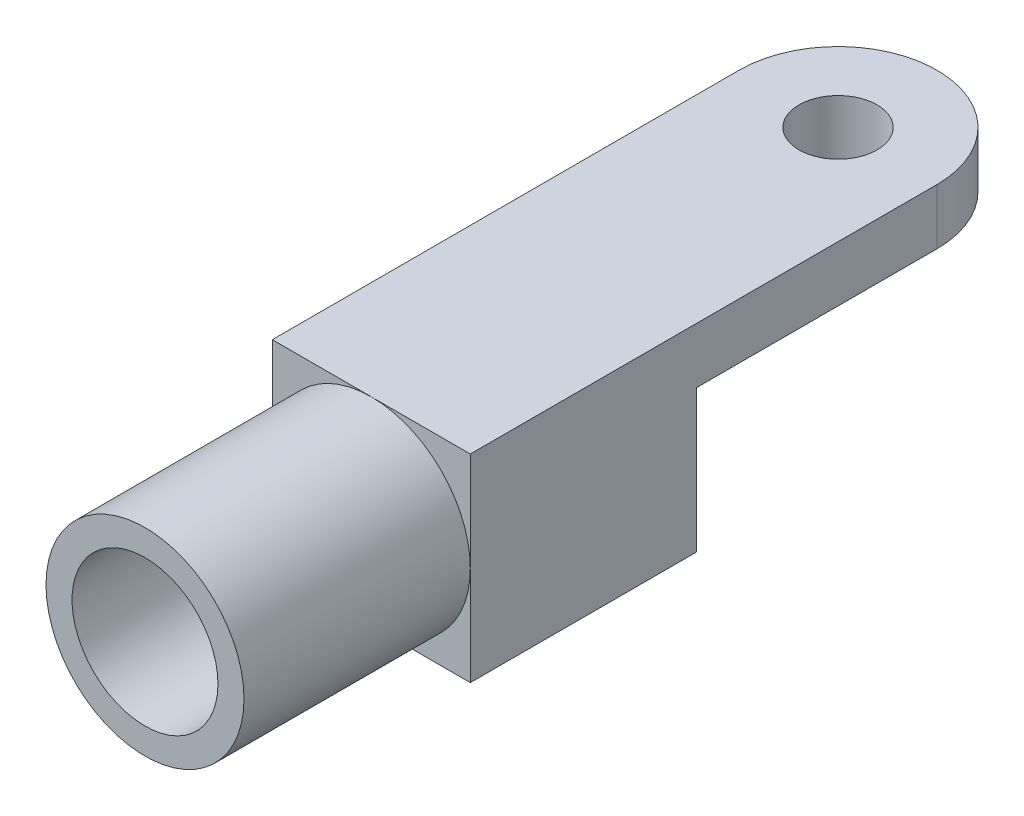
ISO-10303-21;
HEADER;
FILE_DESCRIPTION(('STEP AP214'),'2;1');
FILE_NAME('part.step','',(''),(''),'','','');
FILE_SCHEMA(('AUTOMOTIVE_DESIGN { 1 0 10303 214 1 1 1 1 }'));
ENDSEC;
DATA;
#1=APPLICATION_CONTEXT('core data for automotive mechanical design processes');
#2=APPLICATION_PROTOCOL_DEFINITION('international standard','automotive_design',2000,#1);
#3=PRODUCT_CONTEXT('',#1,'mechanical');
#4=PRODUCT('Part','Part','',(#3));
#5=PRODUCT_RELATED_PRODUCT_CATEGORY('part','',(#4));
#6=PRODUCT_DEFINITION_FORMATION('','',#4);
#7=PRODUCT_DEFINITION_CONTEXT('part definition',#1,'design');
#8=PRODUCT_DEFINITION('design','',#6,#7);
#9=PRODUCT_DEFINITION_SHAPE('','',#8);
#10=(LENGTH_UNIT() NAMED_UNIT(*) SI_UNIT(.MILLI.,.METRE.));
#11=(NAMED_UNIT(*) PLANE_ANGLE_UNIT() SI_UNIT($,.RADIAN.));
#12=(NAMED_UNIT(*) SI_UNIT($,.STERADIAN.) SOLID_ANGLE_UNIT());
#13=UNCERTAINTY_MEASURE_WITH_UNIT(LENGTH_MEASURE(1.E-05),#10,'distance_accuracy_value','');
#14=(GEOMETRIC_REPRESENTATION_CONTEXT(3) GLOBAL_UNCERTAINTY_ASSIGNED_CONTEXT((#13)) GLOBAL_UNIT_ASSIGNED_CONTEXT((#10,
#11,#12)) REPRESENTATION_CONTEXT('',''));
#15=CARTESIAN_POINT('',(0.,0.,0.));
#16=DIRECTION('',(0.,0.,1.));
#17=DIRECTION('',(1.,0.,0.));
#18=AXIS2_PLACEMENT_3D('',#15,#16,#17);
#19=CARTESIAN_POINT('',(4.445,-4.445,-25.4));
#20=DIRECTION('',(0.,1.,0.));
#21=DIRECTION('',(-1.,0.,0.));
#22=AXIS2_PLACEMENT_3D('',#19,#20,#21);
#23=PLANE('',#22);
#24=DIRECTION('',(0.,0.,1.));
#25=VECTOR('',#24,1.);
#26=CARTESIAN_POINT('',(-4.445,-4.445,-25.4));
#27=LINE('',#26,#25);
#28=CARTESIAN_POINT('',(-4.445,-4.445,-10.16));
#29=VERTEX_POINT('',#28);
#30=CARTESIAN_POINT('',(-4.445,-4.445,0.));
#31=VERTEX_POINT('',#30);
#32=EDGE_CURVE('E244',#29,#31,#27,.T.);
#33=ORIENTED_EDGE('',*,*,#32,.F.);
#34=DIRECTION('',(-1.,0.,0.));
#35=VECTOR('',#34,1.);
#36=CARTESIAN_POINT('',(4.445,-4.445,-10.16));
#37=LINE('',#36,#35);
#38=CARTESIAN_POINT('',(4.445,-4.445,-10.16));
#39=VERTEX_POINT('',#38);
#40=EDGE_CURVE('E195',#39,#29,#37,.T.);
#41=ORIENTED_EDGE('',*,*,#40,.F.);
#42=DIRECTION('',(0.,0.,1.));
#43=VECTOR('',#42,1.);
#44=CARTESIAN_POINT('',(4.445,-4.445,-25.4));
#45=LINE('',#44,#43);
#46=CARTESIAN_POINT('',(4.445,-4.445,0.));
#47=VERTEX_POINT('',#46);
#48=EDGE_CURVE('E208',#39,#47,#45,.T.);
#49=ORIENTED_EDGE('',*,*,#48,.T.);
#50=DIRECTION('',(-1.,0.,0.));
#51=VECTOR('',#50,1.);
#52=CARTESIAN_POINT('',(4.445,-4.445,0.));
#53=LINE('',#52,#51);
#54=CARTESIAN_POINT('',(0.,-4.445,0.));
#55=VERTEX_POINT('',#54);
#56=EDGE_CURVE('E229',#47,#55,#53,.T.);
#57=ORIENTED_EDGE('',*,*,#56,.T.);
#58=EDGE_CURVE('E228',#55,#31,#53,.T.);
#59=ORIENTED_EDGE('',*,*,#58,.T.);
#60=EDGE_LOOP('',(#33,#41,#49,#57,#59));
#61=FACE_BOUND('',#60,.T.);
#62=ADVANCED_FACE('F117',(#61),#23,.F.);
#63=CARTESIAN_POINT('',(4.445,4.445,-25.4));
#64=DIRECTION('',(0.,-1.,0.));
#65=DIRECTION('',(1.,0.,0.));
#66=AXIS2_PLACEMENT_3D('',#63,#64,#65);
#67=PLANE('',#66);
#68=CARTESIAN_POINT('',(0.,4.445,-20.955));
#69=DIRECTION('',(0.,-1.,0.));
#70=DIRECTION('',(0.,0.,-1.));
#71=AXIS2_PLACEMENT_3D('',#68,#69,#70);
#72=CIRCLE('',#71,1.7526);
#73=CARTESIAN_POINT('',(0.,4.445,-22.7076));
#74=VERTEX_POINT('',#73);
#75=EDGE_CURVE('E216',#74,#74,#72,.T.);
#76=ORIENTED_EDGE('',*,*,#75,.T.);
#77=EDGE_LOOP('',(#76));
#78=FACE_BOUND('',#77,.T.);
#79=DIRECTION('',(0.,0.,1.));
#80=VECTOR('',#79,1.);
#81=CARTESIAN_POINT('',(4.445,4.445,-25.4));
#82=LINE('',#81,#80);
#83=CARTESIAN_POINT('',(4.445,4.445,-20.955));
#84=VERTEX_POINT('',#83);
#85=CARTESIAN_POINT('',(4.445,4.445,0.));
#86=VERTEX_POINT('',#85);
#87=EDGE_CURVE('E240',#84,#86,#82,.T.);
#88=ORIENTED_EDGE('',*,*,#87,.F.);
#89=CARTESIAN_POINT('',(0.,4.445,-20.955));
#90=DIRECTION('',(0.,-1.,0.));
#91=DIRECTION('',(0.,0.,-1.));
#92=AXIS2_PLACEMENT_3D('',#89,#90,#91);
#93=CIRCLE('',#92,4.445);
#94=CARTESIAN_POINT('',(-4.445,4.445,-20.955));
#95=VERTEX_POINT('',#94);
#96=EDGE_CURVE('E221',#95,#84,#93,.T.);
#97=ORIENTED_EDGE('',*,*,#96,.F.);
#98=DIRECTION('',(0.,0.,1.));
#99=VECTOR('',#98,1.);
#100=CARTESIAN_POINT('',(-4.445,4.445,-25.4));
#101=LINE('',#100,#99);
#102=CARTESIAN_POINT('',(-4.445,4.445,0.));
#103=VERTEX_POINT('',#102);
#104=EDGE_CURVE('E242',#95,#103,#101,.T.);
#105=ORIENTED_EDGE('',*,*,#104,.T.);
#106=DIRECTION('',(1.,0.,0.));
#107=VECTOR('',#106,1.);
#108=CARTESIAN_POINT('',(4.445,4.445,0.));
#109=LINE('',#108,#107);
#110=CARTESIAN_POINT('',(0.,4.445,0.));
#111=VERTEX_POINT('',#110);
#112=EDGE_CURVE('E237',#103,#111,#109,.T.);
#113=ORIENTED_EDGE('',*,*,#112,.T.);
#114=EDGE_CURVE('E236',#111,#86,#109,.T.);
#115=ORIENTED_EDGE('',*,*,#114,.T.);
#116=EDGE_LOOP('',(#88,#97,#105,#113,#115));
#117=FACE_BOUND('',#116,.T.);
#118=ADVANCED_FACE('F280',(#78,#117),#67,.F.);
#119=CARTESIAN_POINT('',(4.445,4.445,-25.4));
#120=DIRECTION('',(-1.,0.,0.));
#121=DIRECTION('',(0.,-1.,0.));
#122=AXIS2_PLACEMENT_3D('',#119,#120,#121);
#123=PLANE('',#122);
#124=ORIENTED_EDGE('',*,*,#48,.F.);
#125=DIRECTION('',(0.,1.,0.));
#126=VECTOR('',#125,1.);
#127=CARTESIAN_POINT('',(4.445,-4.445,-10.16));
#128=LINE('',#127,#126);
#129=CARTESIAN_POINT('',(4.445,1.94564,-10.16));
#130=VERTEX_POINT('',#129);
#131=EDGE_CURVE('E189',#39,#130,#128,.T.);
#132=ORIENTED_EDGE('',*,*,#131,.T.);
#133=DIRECTION('',(0.,0.,-1.));
#134=VECTOR('',#133,1.);
#135=CARTESIAN_POINT('',(4.445,1.94564,-10.16));
#136=LINE('',#135,#134);
#137=CARTESIAN_POINT('',(4.445,1.94564,-20.955));
#138=VERTEX_POINT('',#137);
#139=EDGE_CURVE('E196',#130,#138,#136,.T.);
#140=ORIENTED_EDGE('',*,*,#139,.T.);
#141=DIRECTION('',(0.,-1.,0.));
#142=VECTOR('',#141,1.);
#143=CARTESIAN_POINT('',(4.445,4.445,-20.955));
#144=LINE('',#143,#142);
#145=EDGE_CURVE('E219',#84,#138,#144,.T.);
#146=ORIENTED_EDGE('',*,*,#145,.F.);
#147=ORIENTED_EDGE('',*,*,#87,.T.);
#148=DIRECTION('',(0.,-1.,0.));
#149=VECTOR('',#148,1.);
#150=CARTESIAN_POINT('',(4.445,4.445,0.));
#151=LINE('',#150,#149);
#152=CARTESIAN_POINT('',(4.445,0.,0.));
#153=VERTEX_POINT('',#152);
#154=EDGE_CURVE('E134',#86,#153,#151,.T.);
#155=ORIENTED_EDGE('',*,*,#154,.T.);
#156=EDGE_CURVE('E226',#153,#47,#151,.T.);
#157=ORIENTED_EDGE('',*,*,#156,.T.);
#158=EDGE_LOOP('',(#124,#132,#140,#146,#147,#155,#157));
#159=FACE_BOUND('',#158,.T.);
#160=ADVANCED_FACE('F207',(#159),#123,.F.);
#161=CARTESIAN_POINT('',(0.,0.,10.16));
#162=DIRECTION('',(0.,0.,1.));
#163=DIRECTION('',(1.,0.,0.));
#164=AXIS2_PLACEMENT_3D('',#161,#162,#163);
#165=PLANE('',#164);
#166=CARTESIAN_POINT('',(0.,0.,10.16));
#167=DIRECTION('',(0.,0.,1.));
#168=DIRECTION('',(1.,0.,0.));
#169=AXIS2_PLACEMENT_3D('',#166,#167,#168);
#170=CIRCLE('',#169,4.445);
#171=CARTESIAN_POINT('',(4.445,0.,10.16));
#172=VERTEX_POINT('',#171);
#173=EDGE_CURVE('E12',#172,#172,#170,.T.);
#174=ORIENTED_EDGE('',*,*,#173,.T.);
#175=EDGE_LOOP('',(#174));
#176=FACE_BOUND('',#175,.T.);
#177=CARTESIAN_POINT('',(0.,0.,10.16));
#178=DIRECTION('',(0.,0.,1.));
#179=DIRECTION('',(1.,0.,0.));
#180=AXIS2_PLACEMENT_3D('',#177,#178,#179);
#181=CIRCLE('',#180,3.2750000032);
#182=CARTESIAN_POINT('',(3.2750000032,0.,10.16));
#183=VERTEX_POINT('',#182);
#184=EDGE_CURVE('E248',#183,#183,#181,.T.);
#185=ORIENTED_EDGE('',*,*,#184,.F.);
#186=EDGE_LOOP('',(#185));
#187=FACE_BOUND('',#186,.T.);
#188=ADVANCED_FACE('F307',(#176,#187),#165,.T.);
#189=CARTESIAN_POINT('',(0.,0.,10.16));
#190=DIRECTION('',(0.,0.,-1.));
#191=DIRECTION('',(-1.,0.,0.));
#192=AXIS2_PLACEMENT_3D('',#189,#190,#191);
#193=CYLINDRICAL_SURFACE('',#192,4.445);
#194=ORIENTED_EDGE('',*,*,#173,.F.);
#195=EDGE_LOOP('',(#194));
#196=FACE_BOUND('',#195,.T.);
#197=CARTESIAN_POINT('',(0.,0.,0.));
#198=DIRECTION('',(0.,0.,1.));
#199=DIRECTION('',(1.,0.,0.));
#200=AXIS2_PLACEMENT_3D('',#197,#198,#199);
#201=CIRCLE('',#200,4.445);
#202=EDGE_CURVE('E126',#153,#111,#201,.T.);
#203=ORIENTED_EDGE('',*,*,#202,.T.);
#204=CARTESIAN_POINT('',(-4.445,0.,0.));
#205=VERTEX_POINT('',#204);
#206=EDGE_CURVE('E253',#111,#205,#201,.T.);
#207=ORIENTED_EDGE('',*,*,#206,.T.);
#208=EDGE_CURVE('E257',#205,#55,#201,.T.);
#209=ORIENTED_EDGE('',*,*,#208,.T.);
#210=EDGE_CURVE('E141',#55,#153,#201,.T.);
#211=ORIENTED_EDGE('',*,*,#210,.T.);
#212=EDGE_LOOP('',(#203,#207,#209,#211));
#213=FACE_BOUND('',#212,.T.);
#214=ADVANCED_FACE('F119',(#196,#213),#193,.T.);
#215=CARTESIAN_POINT('',(0.,0.,10.16));
#216=DIRECTION('',(0.,0.,-1.));
#217=DIRECTION('',(-1.,0.,0.));
#218=AXIS2_PLACEMENT_3D('',#215,#216,#217);
#219=CYLINDRICAL_SURFACE('',#218,3.2750000032);
#220=ORIENTED_EDGE('',*,*,#184,.T.);
#221=EDGE_LOOP('',(#220));
#222=FACE_BOUND('',#221,.T.);
#223=CARTESIAN_POINT('',(0.,0.,0.));
#224=DIRECTION('',(0.,0.,1.));
#225=DIRECTION('',(1.,0.,0.));
#226=AXIS2_PLACEMENT_3D('',#223,#224,#225);
#227=CIRCLE('',#226,3.2750000032);
#228=CARTESIAN_POINT('',(3.2750000032,0.,0.));
#229=VERTEX_POINT('',#228);
#230=EDGE_CURVE('E247',#229,#229,#227,.T.);
#231=ORIENTED_EDGE('',*,*,#230,.F.);
#232=EDGE_LOOP('',(#231));
#233=FACE_BOUND('',#232,.T.);
#234=ADVANCED_FACE('F308',(#222,#233),#219,.F.);
#235=CARTESIAN_POINT('',(0.,0.,0.));
#236=DIRECTION('',(0.,0.,-1.));
#237=DIRECTION('',(-1.,0.,0.));
#238=AXIS2_PLACEMENT_3D('',#235,#236,#237);
#239=PLANE('',#238);
#240=ORIENTED_EDGE('',*,*,#230,.T.);
#241=EDGE_LOOP('',(#240));
#242=FACE_BOUND('',#241,.T.);
#243=ADVANCED_FACE('F295',(#242),#239,.F.);
#244=ORIENTED_EDGE('',*,*,#202,.F.);
#245=ORIENTED_EDGE('',*,*,#154,.F.);
#246=ORIENTED_EDGE('',*,*,#114,.F.);
#247=EDGE_LOOP('',(#244,#245,#246));
#248=FACE_BOUND('',#247,.T.);
#249=ADVANCED_FACE('F276',(#248),#239,.F.);
#250=ORIENTED_EDGE('',*,*,#206,.F.);
#251=ORIENTED_EDGE('',*,*,#112,.F.);
#252=DIRECTION('',(0.,1.,0.));
#253=VECTOR('',#252,1.);
#254=CARTESIAN_POINT('',(-4.445,4.445,0.));
#255=LINE('',#254,#253);
#256=EDGE_CURVE('E232',#205,#103,#255,.T.);
#257=ORIENTED_EDGE('',*,*,#256,.F.);
#258=EDGE_LOOP('',(#250,#251,#257));
#259=FACE_BOUND('',#258,.T.);
#260=ADVANCED_FACE('F267',(#259),#239,.F.);
#261=ORIENTED_EDGE('',*,*,#208,.F.);
#262=EDGE_CURVE('E233',#31,#205,#255,.T.);
#263=ORIENTED_EDGE('',*,*,#262,.F.);
#264=ORIENTED_EDGE('',*,*,#58,.F.);
#265=EDGE_LOOP('',(#261,#263,#264));
#266=FACE_BOUND('',#265,.T.);
#267=ADVANCED_FACE('F262',(#266),#239,.F.);
#268=CARTESIAN_POINT('',(-4.445,4.445,-25.4));
#269=DIRECTION('',(1.,0.,0.));
#270=DIRECTION('',(0.,0.,-1.));
#271=AXIS2_PLACEMENT_3D('',#268,#269,#270);
#272=PLANE('',#271);
#273=DIRECTION('',(0.,0.,-1.));
#274=VECTOR('',#273,1.);
#275=CARTESIAN_POINT('',(-4.445,1.94564,-10.16));
#276=LINE('',#275,#274);
#277=CARTESIAN_POINT('',(-4.445,1.94564,-10.16));
#278=VERTEX_POINT('',#277);
#279=CARTESIAN_POINT('',(-4.445,1.94564,-20.955));
#280=VERTEX_POINT('',#279);
#281=EDGE_CURVE('E209',#278,#280,#276,.T.);
#282=ORIENTED_EDGE('',*,*,#281,.F.);
#283=DIRECTION('',(0.,1.,0.));
#284=VECTOR('',#283,1.);
#285=CARTESIAN_POINT('',(-4.445,-4.445,-10.16));
#286=LINE('',#285,#284);
#287=EDGE_CURVE('E192',#29,#278,#286,.T.);
#288=ORIENTED_EDGE('',*,*,#287,.F.);
#289=ORIENTED_EDGE('',*,*,#32,.T.);
#290=ORIENTED_EDGE('',*,*,#262,.T.);
#291=ORIENTED_EDGE('',*,*,#256,.T.);
#292=ORIENTED_EDGE('',*,*,#104,.F.);
#293=DIRECTION('',(0.,-1.,0.));
#294=VECTOR('',#293,1.);
#295=CARTESIAN_POINT('',(-4.445,4.445,-20.955));
#296=LINE('',#295,#294);
#297=EDGE_CURVE('E223',#95,#280,#296,.T.);
#298=ORIENTED_EDGE('',*,*,#297,.T.);
#299=EDGE_LOOP('',(#282,#288,#289,#290,#291,#292,#298));
#300=FACE_BOUND('',#299,.T.);
#301=ADVANCED_FACE('F271',(#300),#272,.F.);
#302=ORIENTED_EDGE('',*,*,#210,.F.);
#303=ORIENTED_EDGE('',*,*,#56,.F.);
#304=ORIENTED_EDGE('',*,*,#156,.F.);
#305=EDGE_LOOP('',(#302,#303,#304));
#306=FACE_BOUND('',#305,.T.);
#307=ADVANCED_FACE('F274',(#306),#239,.F.);
#308=CARTESIAN_POINT('',(0.,4.445,-20.955));
#309=DIRECTION('',(0.,-1.,0.));
#310=DIRECTION('',(0.,0.,-1.));
#311=AXIS2_PLACEMENT_3D('',#308,#309,#310);
#312=CYLINDRICAL_SURFACE('',#311,4.445);
#313=CARTESIAN_POINT('',(0.,1.94564,-20.955));
#314=DIRECTION('',(0.,1.,0.));
#315=DIRECTION('',(0.,0.,1.));
#316=AXIS2_PLACEMENT_3D('',#313,#314,#315);
#317=CIRCLE('',#316,4.445);
#318=EDGE_CURVE('E202',#280,#138,#317,.F.);
#319=ORIENTED_EDGE('',*,*,#318,.F.);
#320=ORIENTED_EDGE('',*,*,#297,.F.);
#321=ORIENTED_EDGE('',*,*,#96,.T.);
#322=ORIENTED_EDGE('',*,*,#145,.T.);
#323=EDGE_LOOP('',(#319,#320,#321,#322));
#324=FACE_BOUND('',#323,.T.);
#325=ADVANCED_FACE('F283',(#324),#312,.T.);
#326=CARTESIAN_POINT('',(0.,4.445,-20.955));
#327=DIRECTION('',(0.,-1.,0.));
#328=DIRECTION('',(0.,0.,-1.));
#329=AXIS2_PLACEMENT_3D('',#326,#327,#328);
#330=CYLINDRICAL_SURFACE('',#329,1.7526);
#331=CARTESIAN_POINT('',(0.,1.94564,-20.955));
#332=DIRECTION('',(0.,1.,0.));
#333=DIRECTION('',(0.,0.,1.));
#334=AXIS2_PLACEMENT_3D('',#331,#332,#333);
#335=CIRCLE('',#334,1.7526);
#336=CARTESIAN_POINT('',(0.,1.94564,-19.2024));
#337=VERTEX_POINT('',#336);
#338=EDGE_CURVE('E121',#337,#337,#335,.F.);
#339=ORIENTED_EDGE('',*,*,#338,.T.);
#340=EDGE_LOOP('',(#339));
#341=FACE_BOUND('',#340,.T.);
#342=ORIENTED_EDGE('',*,*,#75,.F.);
#343=EDGE_LOOP('',(#342));
#344=FACE_BOUND('',#343,.T.);
#345=ADVANCED_FACE('F285',(#341,#344),#330,.F.);
#346=CARTESIAN_POINT('',(4.445,1.94564,-10.16));
#347=DIRECTION('',(0.,1.,0.));
#348=DIRECTION('',(0.,0.,1.));
#349=AXIS2_PLACEMENT_3D('',#346,#347,#348);
#350=PLANE('',#349);
#351=ORIENTED_EDGE('',*,*,#318,.T.);
#352=ORIENTED_EDGE('',*,*,#139,.F.);
#353=DIRECTION('',(-1.,0.,0.));
#354=VECTOR('',#353,1.);
#355=CARTESIAN_POINT('',(4.445,1.94564,-10.16));
#356=LINE('',#355,#354);
#357=EDGE_CURVE('E185',#130,#278,#356,.T.);
#358=ORIENTED_EDGE('',*,*,#357,.T.);
#359=ORIENTED_EDGE('',*,*,#281,.T.);
#360=EDGE_LOOP('',(#351,#352,#358,#359));
#361=FACE_BOUND('',#360,.T.);
#362=ORIENTED_EDGE('',*,*,#338,.F.);
#363=EDGE_LOOP('',(#362));
#364=FACE_BOUND('',#363,.T.);
#365=ADVANCED_FACE('F199',(#361,#364),#350,.F.);
#366=CARTESIAN_POINT('',(4.445,-4.445,-10.16));
#367=DIRECTION('',(0.,0.,1.));
#368=DIRECTION('',(0.,-1.,0.));
#369=AXIS2_PLACEMENT_3D('',#366,#367,#368);
#370=PLANE('',#369);
#371=ORIENTED_EDGE('',*,*,#287,.T.);
#372=ORIENTED_EDGE('',*,*,#357,.F.);
#373=ORIENTED_EDGE('',*,*,#131,.F.);
#374=ORIENTED_EDGE('',*,*,#40,.T.);
#375=EDGE_LOOP('',(#371,#372,#373,#374));
#376=FACE_BOUND('',#375,.T.);
#377=ADVANCED_FACE('F187',(#376),#370,.F.);
#378=CLOSED_SHELL('',(#62,#118,#160,#188,#214,#234,#243,#249,#260,#267,#301,#307,#325,#345,#365,#377));
#379=MANIFOLD_SOLID_BREP('B2',#378);
#380=ADVANCED_BREP_SHAPE_REPRESENTATION('',(#18,#379),#14);
#381=SHAPE_DEFINITION_REPRESENTATION(#9,#380);
ENDSEC;
END-ISO-10303-21;
